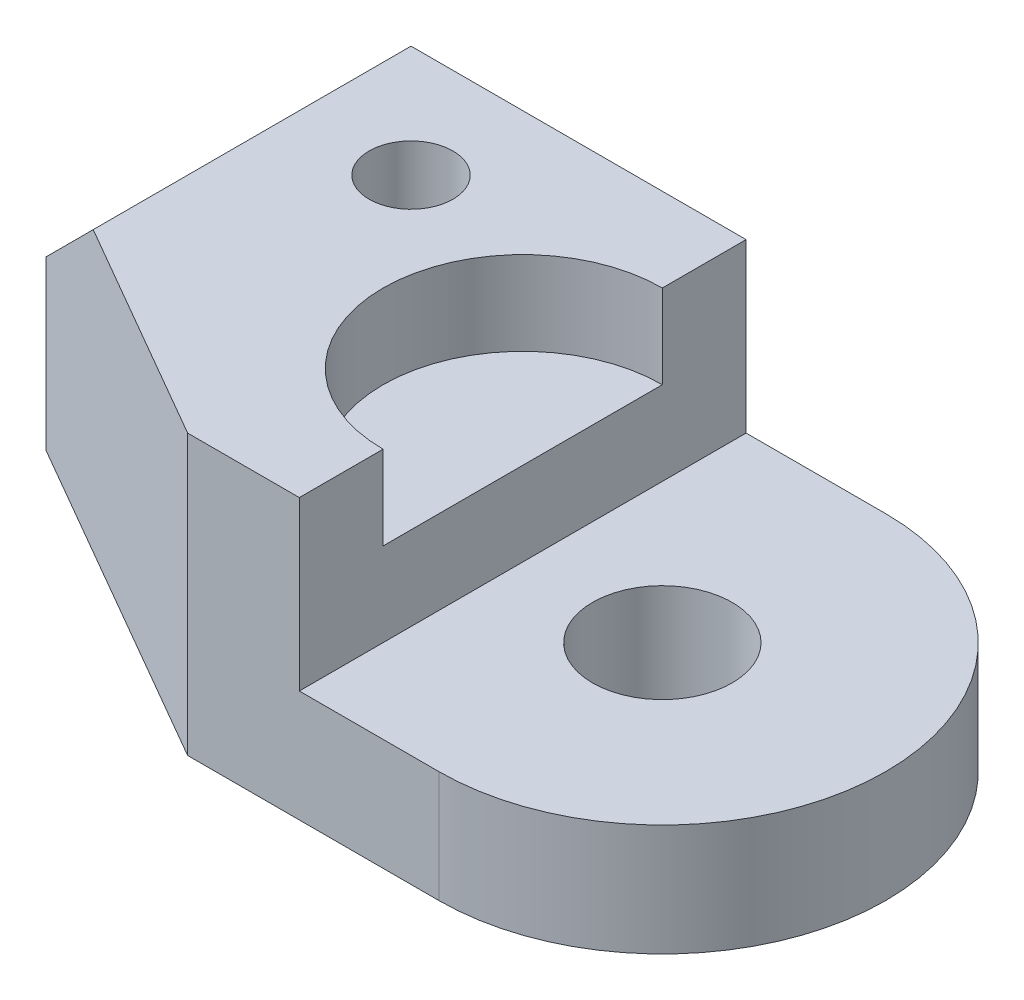
ISO-10303-21;
HEADER;
FILE_DESCRIPTION(('STEP AP214'),'2;1');
FILE_NAME('part.step','',(''),(''),'','','');
FILE_SCHEMA(('AUTOMOTIVE_DESIGN { 1 0 10303 214 1 1 1 1 }'));
ENDSEC;
DATA;
#1=APPLICATION_CONTEXT('core data for automotive mechanical design processes');
#2=APPLICATION_PROTOCOL_DEFINITION('international standard','automotive_design',2000,#1);
#3=PRODUCT_CONTEXT('',#1,'mechanical');
#4=PRODUCT('Part','Part','',(#3));
#5=PRODUCT_RELATED_PRODUCT_CATEGORY('part','',(#4));
#6=PRODUCT_DEFINITION_FORMATION('','',#4);
#7=PRODUCT_DEFINITION_CONTEXT('part definition',#1,'design');
#8=PRODUCT_DEFINITION('design','',#6,#7);
#9=PRODUCT_DEFINITION_SHAPE('','',#8);
#10=(LENGTH_UNIT() NAMED_UNIT(*) SI_UNIT(.MILLI.,.METRE.));
#11=(NAMED_UNIT(*) PLANE_ANGLE_UNIT() SI_UNIT($,.RADIAN.));
#12=(NAMED_UNIT(*) SI_UNIT($,.STERADIAN.) SOLID_ANGLE_UNIT());
#13=UNCERTAINTY_MEASURE_WITH_UNIT(LENGTH_MEASURE(1.E-05),#10,'distance_accuracy_value','');
#14=(GEOMETRIC_REPRESENTATION_CONTEXT(3) GLOBAL_UNCERTAINTY_ASSIGNED_CONTEXT((#13)) GLOBAL_UNIT_ASSIGNED_CONTEXT((#10,
#11,#12)) REPRESENTATION_CONTEXT('',''));
#15=CARTESIAN_POINT('',(0.,0.,0.));
#16=DIRECTION('',(0.,0.,1.));
#17=DIRECTION('',(1.,0.,0.));
#18=AXIS2_PLACEMENT_3D('',#15,#16,#17);
#19=CARTESIAN_POINT('',(0.,25.4,0.));
#20=DIRECTION('',(0.,1.,0.));
#21=DIRECTION('',(0.,0.,1.));
#22=AXIS2_PLACEMENT_3D('',#19,#20,#21);
#23=PLANE('',#22);
#24=DIRECTION('',(-1.,0.,0.));
#25=VECTOR('',#24,1.);
#26=CARTESIAN_POINT('',(-31.75,25.4,-50.8));
#27=LINE('',#26,#25);
#28=CARTESIAN_POINT('',(0.,25.4,-50.8));
#29=VERTEX_POINT('',#28);
#30=CARTESIAN_POINT('',(-31.75,25.4,-50.8));
#31=VERTEX_POINT('',#30);
#32=EDGE_CURVE('E198',#29,#31,#27,.T.);
#33=ORIENTED_EDGE('',*,*,#32,.T.);
#34=DIRECTION('',(0.,0.,1.));
#35=VECTOR('',#34,1.);
#36=CARTESIAN_POINT('',(-31.75,25.4,-50.8));
#37=LINE('',#36,#35);
#38=CARTESIAN_POINT('',(-31.75,25.4,50.8));
#39=VERTEX_POINT('',#38);
#40=EDGE_CURVE('E202',#31,#39,#37,.T.);
#41=ORIENTED_EDGE('',*,*,#40,.T.);
#42=DIRECTION('',(1.,0.,0.));
#43=VECTOR('',#42,1.);
#44=CARTESIAN_POINT('',(-31.75,25.4,50.8));
#45=LINE('',#44,#43);
#46=CARTESIAN_POINT('',(0.,25.4,50.8));
#47=VERTEX_POINT('',#46);
#48=EDGE_CURVE('E207',#39,#47,#45,.T.);
#49=ORIENTED_EDGE('',*,*,#48,.T.);
#50=CARTESIAN_POINT('',(0.,25.4,0.));
#51=DIRECTION('',(0.,1.,0.));
#52=DIRECTION('',(0.,0.,1.));
#53=AXIS2_PLACEMENT_3D('',#50,#51,#52);
#54=CIRCLE('',#53,50.8);
#55=EDGE_CURVE('E210',#47,#29,#54,.T.);
#56=ORIENTED_EDGE('',*,*,#55,.T.);
#57=EDGE_LOOP('',(#33,#41,#49,#56));
#58=FACE_BOUND('',#57,.T.);
#59=CARTESIAN_POINT('',(0.,25.4,0.));
#60=DIRECTION('',(0.,1.,0.));
#61=DIRECTION('',(0.,0.,1.));
#62=AXIS2_PLACEMENT_3D('',#59,#60,#61);
#63=CIRCLE('',#62,15.875);
#64=CARTESIAN_POINT('',(0.,25.4,15.875));
#65=VERTEX_POINT('',#64);
#66=EDGE_CURVE('E190',#65,#65,#63,.T.);
#67=ORIENTED_EDGE('',*,*,#66,.F.);
#68=EDGE_LOOP('',(#67));
#69=FACE_BOUND('',#68,.T.);
#70=ADVANCED_FACE('F38',(#58,#69),#23,.T.);
#71=CARTESIAN_POINT('',(0.,0.,0.));
#72=DIRECTION('',(0.,1.,0.));
#73=DIRECTION('',(0.,0.,1.));
#74=AXIS2_PLACEMENT_3D('',#71,#72,#73);
#75=PLANE('',#74);
#76=CARTESIAN_POINT('',(-82.55,0.,-25.4));
#77=DIRECTION('',(0.,1.,0.));
#78=DIRECTION('',(0.,0.,1.));
#79=AXIS2_PLACEMENT_3D('',#76,#77,#78);
#80=CIRCLE('',#79,9.52499999999999);
#81=CARTESIAN_POINT('',(-82.55,0.,-15.875));
#82=VERTEX_POINT('',#81);
#83=EDGE_CURVE('E138',#82,#82,#80,.T.);
#84=ORIENTED_EDGE('',*,*,#83,.T.);
#85=EDGE_LOOP('',(#84));
#86=FACE_BOUND('',#85,.T.);
#87=DIRECTION('',(-1.,0.,0.));
#88=VECTOR('',#87,1.);
#89=CARTESIAN_POINT('',(-31.75,0.,-50.8));
#90=LINE('',#89,#88);
#91=CARTESIAN_POINT('',(0.,0.,-50.8));
#92=VERTEX_POINT('',#91);
#93=CARTESIAN_POINT('',(-133.35,0.,-50.8));
#94=VERTEX_POINT('',#93);
#95=EDGE_CURVE('E194',#92,#94,#90,.T.);
#96=ORIENTED_EDGE('',*,*,#95,.F.);
#97=CARTESIAN_POINT('',(0.,0.,0.));
#98=DIRECTION('',(0.,1.,0.));
#99=DIRECTION('',(0.,0.,1.));
#100=AXIS2_PLACEMENT_3D('',#97,#98,#99);
#101=CIRCLE('',#100,50.8);
#102=CARTESIAN_POINT('',(0.,0.,50.8));
#103=VERTEX_POINT('',#102);
#104=EDGE_CURVE('E203',#103,#92,#101,.T.);
#105=ORIENTED_EDGE('',*,*,#104,.F.);
#106=DIRECTION('',(1.,0.,0.));
#107=VECTOR('',#106,1.);
#108=CARTESIAN_POINT('',(-31.75,0.,50.8));
#109=LINE('',#108,#107);
#110=CARTESIAN_POINT('',(-57.15,0.,50.8));
#111=VERTEX_POINT('',#110);
#112=EDGE_CURVE('E217',#111,#103,#109,.T.);
#113=ORIENTED_EDGE('',*,*,#112,.F.);
#114=DIRECTION('',(0.866025403784438,0.,0.500000000000001));
#115=VECTOR('',#114,1.);
#116=CARTESIAN_POINT('',(-57.15,0.,50.8));
#117=LINE('',#116,#115);
#118=CARTESIAN_POINT('',(-133.35,0.,6.80590948775044));
#119=VERTEX_POINT('',#118);
#120=EDGE_CURVE('E169',#119,#111,#117,.T.);
#121=ORIENTED_EDGE('',*,*,#120,.F.);
#122=DIRECTION('',(0.,0.,1.));
#123=VECTOR('',#122,1.);
#124=CARTESIAN_POINT('',(-133.35,0.,-50.8));
#125=LINE('',#124,#123);
#126=EDGE_CURVE('E150',#94,#119,#125,.T.);
#127=ORIENTED_EDGE('',*,*,#126,.F.);
#128=EDGE_LOOP('',(#96,#105,#113,#121,#127));
#129=FACE_BOUND('',#128,.T.);
#130=CARTESIAN_POINT('',(0.,0.,0.));
#131=DIRECTION('',(0.,1.,0.));
#132=DIRECTION('',(0.,0.,1.));
#133=AXIS2_PLACEMENT_3D('',#130,#131,#132);
#134=CIRCLE('',#133,15.875);
#135=CARTESIAN_POINT('',(0.,0.,15.875));
#136=VERTEX_POINT('',#135);
#137=EDGE_CURVE('E189',#136,#136,#134,.T.);
#138=ORIENTED_EDGE('',*,*,#137,.T.);
#139=EDGE_LOOP('',(#138));
#140=FACE_BOUND('',#139,.T.);
#141=ADVANCED_FACE('F236',(#86,#129,#140),#75,.F.);
#142=CARTESIAN_POINT('',(-31.75,25.4,-50.8));
#143=DIRECTION('',(0.,0.,1.));
#144=DIRECTION('',(1.,0.,0.));
#145=AXIS2_PLACEMENT_3D('',#142,#143,#144);
#146=PLANE('',#145);
#147=DIRECTION('',(0.,-1.,0.));
#148=VECTOR('',#147,1.);
#149=CARTESIAN_POINT('',(-133.35,63.5,-50.8));
#150=LINE('',#149,#148);
#151=CARTESIAN_POINT('',(-133.35,38.1,-50.8));
#152=VERTEX_POINT('',#151);
#153=EDGE_CURVE('E182',#152,#94,#150,.T.);
#154=ORIENTED_EDGE('',*,*,#153,.F.);
#155=DIRECTION('',(-0.707106781186543,-0.707106781186552,0.));
#156=VECTOR('',#155,1.);
#157=CARTESIAN_POINT('',(-133.35,38.1,-50.8));
#158=LINE('',#157,#156);
#159=CARTESIAN_POINT('',(-107.95,63.5,-50.8));
#160=VERTEX_POINT('',#159);
#161=EDGE_CURVE('E140',#160,#152,#158,.T.);
#162=ORIENTED_EDGE('',*,*,#161,.F.);
#163=DIRECTION('',(-1.,0.,0.));
#164=VECTOR('',#163,1.);
#165=CARTESIAN_POINT('',(-31.75,63.5,-50.8));
#166=LINE('',#165,#164);
#167=CARTESIAN_POINT('',(-31.75,63.5,-50.8));
#168=VERTEX_POINT('',#167);
#169=EDGE_CURVE('E154',#168,#160,#166,.T.);
#170=ORIENTED_EDGE('',*,*,#169,.F.);
#171=DIRECTION('',(0.,-1.,0.));
#172=VECTOR('',#171,1.);
#173=CARTESIAN_POINT('',(-31.75,63.5,-50.8));
#174=LINE('',#173,#172);
#175=EDGE_CURVE('E185',#168,#31,#174,.T.);
#176=ORIENTED_EDGE('',*,*,#175,.T.);
#177=ORIENTED_EDGE('',*,*,#32,.F.);
#178=DIRECTION('',(0.,-1.,0.));
#179=VECTOR('',#178,1.);
#180=CARTESIAN_POINT('',(0.,25.4,-50.8));
#181=LINE('',#180,#179);
#182=EDGE_CURVE('E213',#29,#92,#181,.T.);
#183=ORIENTED_EDGE('',*,*,#182,.T.);
#184=ORIENTED_EDGE('',*,*,#95,.T.);
#185=EDGE_LOOP('',(#154,#162,#170,#176,#177,#183,#184));
#186=FACE_BOUND('',#185,.T.);
#187=ADVANCED_FACE('F40',(#186),#146,.F.);
#188=CARTESIAN_POINT('',(-31.75,25.4,50.8));
#189=DIRECTION('',(0.,0.,-1.));
#190=DIRECTION('',(-1.,0.,0.));
#191=AXIS2_PLACEMENT_3D('',#188,#189,#190);
#192=PLANE('',#191);
#193=ORIENTED_EDGE('',*,*,#112,.T.);
#194=DIRECTION('',(0.,-1.,0.));
#195=VECTOR('',#194,1.);
#196=CARTESIAN_POINT('',(0.,25.4,50.8));
#197=LINE('',#196,#195);
#198=EDGE_CURVE('E47',#47,#103,#197,.T.);
#199=ORIENTED_EDGE('',*,*,#198,.F.);
#200=ORIENTED_EDGE('',*,*,#48,.F.);
#201=DIRECTION('',(0.,-1.,0.));
#202=VECTOR('',#201,1.);
#203=CARTESIAN_POINT('',(-31.75,63.5,50.8));
#204=LINE('',#203,#202);
#205=CARTESIAN_POINT('',(-31.75,63.5,50.8));
#206=VERTEX_POINT('',#205);
#207=EDGE_CURVE('E165',#206,#39,#204,.T.);
#208=ORIENTED_EDGE('',*,*,#207,.F.);
#209=DIRECTION('',(1.,0.,0.));
#210=VECTOR('',#209,1.);
#211=CARTESIAN_POINT('',(-31.75,63.5,50.8));
#212=LINE('',#211,#210);
#213=CARTESIAN_POINT('',(-57.15,63.5,50.8));
#214=VERTEX_POINT('',#213);
#215=EDGE_CURVE('E162',#214,#206,#212,.T.);
#216=ORIENTED_EDGE('',*,*,#215,.F.);
#217=DIRECTION('',(0.,-1.,0.));
#218=VECTOR('',#217,1.);
#219=CARTESIAN_POINT('',(-57.15,63.5,50.8));
#220=LINE('',#219,#218);
#221=EDGE_CURVE('E175',#214,#111,#220,.T.);
#222=ORIENTED_EDGE('',*,*,#221,.T.);
#223=EDGE_LOOP('',(#193,#199,#200,#208,#216,#222));
#224=FACE_BOUND('',#223,.T.);
#225=ADVANCED_FACE('F249',(#224),#192,.F.);
#226=CARTESIAN_POINT('',(0.,25.4,0.));
#227=DIRECTION('',(0.,-1.,0.));
#228=DIRECTION('',(0.,0.,-1.));
#229=AXIS2_PLACEMENT_3D('',#226,#227,#228);
#230=CYLINDRICAL_SURFACE('',#229,50.8);
#231=ORIENTED_EDGE('',*,*,#104,.T.);
#232=ORIENTED_EDGE('',*,*,#182,.F.);
#233=ORIENTED_EDGE('',*,*,#55,.F.);
#234=ORIENTED_EDGE('',*,*,#198,.T.);
#235=EDGE_LOOP('',(#231,#232,#233,#234));
#236=FACE_BOUND('',#235,.T.);
#237=ADVANCED_FACE('F230',(#236),#230,.T.);
#238=CARTESIAN_POINT('',(0.,25.4,0.));
#239=DIRECTION('',(0.,-1.,0.));
#240=DIRECTION('',(0.,0.,-1.));
#241=AXIS2_PLACEMENT_3D('',#238,#239,#240);
#242=CYLINDRICAL_SURFACE('',#241,15.875);
#243=ORIENTED_EDGE('',*,*,#66,.T.);
#244=EDGE_LOOP('',(#243));
#245=FACE_BOUND('',#244,.T.);
#246=ORIENTED_EDGE('',*,*,#137,.F.);
#247=EDGE_LOOP('',(#246));
#248=FACE_BOUND('',#247,.T.);
#249=ADVANCED_FACE('F279',(#245,#248),#242,.F.);
#250=CARTESIAN_POINT('',(-31.75,63.5,-50.8));
#251=DIRECTION('',(-1.,0.,0.));
#252=DIRECTION('',(0.,0.,1.));
#253=AXIS2_PLACEMENT_3D('',#250,#251,#252);
#254=PLANE('',#253);
#255=DIRECTION('',(0.,0.,-1.));
#256=VECTOR('',#255,1.);
#257=CARTESIAN_POINT('',(-31.75,44.45,-31.75));
#258=LINE('',#257,#256);
#259=CARTESIAN_POINT('',(-31.75,44.45,31.75));
#260=VERTEX_POINT('',#259);
#261=CARTESIAN_POINT('',(-31.75,44.45,-31.75));
#262=VERTEX_POINT('',#261);
#263=EDGE_CURVE('E124',#260,#262,#258,.T.);
#264=ORIENTED_EDGE('',*,*,#263,.F.);
#265=DIRECTION('',(0.,1.,0.));
#266=VECTOR('',#265,1.);
#267=CARTESIAN_POINT('',(-31.75,44.45,31.75));
#268=LINE('',#267,#266);
#269=CARTESIAN_POINT('',(-31.75,63.5,31.75));
#270=VERTEX_POINT('',#269);
#271=EDGE_CURVE('E113',#260,#270,#268,.T.);
#272=ORIENTED_EDGE('',*,*,#271,.T.);
#273=DIRECTION('',(0.,0.,-1.));
#274=VECTOR('',#273,1.);
#275=CARTESIAN_POINT('',(-31.75,63.5,-50.8));
#276=LINE('',#275,#274);
#277=EDGE_CURVE('E151',#206,#270,#276,.T.);
#278=ORIENTED_EDGE('',*,*,#277,.F.);
#279=ORIENTED_EDGE('',*,*,#207,.T.);
#280=ORIENTED_EDGE('',*,*,#40,.F.);
#281=ORIENTED_EDGE('',*,*,#175,.F.);
#282=CARTESIAN_POINT('',(-31.75,63.5,-31.75));
#283=VERTEX_POINT('',#282);
#284=EDGE_CURVE('E155',#283,#168,#276,.T.);
#285=ORIENTED_EDGE('',*,*,#284,.F.);
#286=DIRECTION('',(0.,1.,0.));
#287=VECTOR('',#286,1.);
#288=CARTESIAN_POINT('',(-31.75,44.45,-31.75));
#289=LINE('',#288,#287);
#290=EDGE_CURVE('E54',#262,#283,#289,.T.);
#291=ORIENTED_EDGE('',*,*,#290,.F.);
#292=EDGE_LOOP('',(#264,#272,#278,#279,#280,#281,#285,#291));
#293=FACE_BOUND('',#292,.T.);
#294=ADVANCED_FACE('F130',(#293),#254,.F.);
#295=CARTESIAN_POINT('',(-133.35,63.5,-50.8));
#296=DIRECTION('',(1.,0.,0.));
#297=DIRECTION('',(0.,0.,-1.));
#298=AXIS2_PLACEMENT_3D('',#295,#296,#297);
#299=PLANE('',#298);
#300=DIRECTION('',(0.,-1.,0.));
#301=VECTOR('',#300,1.);
#302=CARTESIAN_POINT('',(-133.35,63.5,6.80590948775044));
#303=LINE('',#302,#301);
#304=CARTESIAN_POINT('',(-133.35,38.1,6.80590948775042));
#305=VERTEX_POINT('',#304);
#306=EDGE_CURVE('E179',#305,#119,#303,.T.);
#307=ORIENTED_EDGE('',*,*,#306,.F.);
#308=DIRECTION('',(0.,0.,-1.));
#309=VECTOR('',#308,1.);
#310=CARTESIAN_POINT('',(-133.35,38.1,50.8));
#311=LINE('',#310,#309);
#312=EDGE_CURVE('E144',#305,#152,#311,.T.);
#313=ORIENTED_EDGE('',*,*,#312,.T.);
#314=ORIENTED_EDGE('',*,*,#153,.T.);
#315=ORIENTED_EDGE('',*,*,#126,.T.);
#316=EDGE_LOOP('',(#307,#313,#314,#315));
#317=FACE_BOUND('',#316,.T.);
#318=ADVANCED_FACE('F259',(#317),#299,.F.);
#319=CARTESIAN_POINT('',(-57.15,63.5,50.8));
#320=DIRECTION('',(0.500000000000001,0.,-0.866025403784438));
#321=DIRECTION('',(-0.866025403784438,0.,-0.500000000000001));
#322=AXIS2_PLACEMENT_3D('',#319,#320,#321);
#323=PLANE('',#322);
#324=DIRECTION('',(0.866025403784438,0.,0.500000000000001));
#325=VECTOR('',#324,1.);
#326=CARTESIAN_POINT('',(-57.15,63.5,50.8));
#327=LINE('',#326,#325);
#328=CARTESIAN_POINT('',(-107.95,63.5,21.4706063251668));
#329=VERTEX_POINT('',#328);
#330=EDGE_CURVE('E159',#329,#214,#327,.T.);
#331=ORIENTED_EDGE('',*,*,#330,.F.);
#332=DIRECTION('',(-0.654653670707974,-0.654653670707981,-0.377964473009226));
#333=VECTOR('',#332,1.);
#334=CARTESIAN_POINT('',(-78.921428571429,92.5285714285717,38.2302598536427));
#335=LINE('',#334,#333);
#336=EDGE_CURVE('E62',#329,#305,#335,.T.);
#337=ORIENTED_EDGE('',*,*,#336,.T.);
#338=ORIENTED_EDGE('',*,*,#306,.T.);
#339=ORIENTED_EDGE('',*,*,#120,.T.);
#340=ORIENTED_EDGE('',*,*,#221,.F.);
#341=EDGE_LOOP('',(#331,#337,#338,#339,#340));
#342=FACE_BOUND('',#341,.T.);
#343=ADVANCED_FACE('F256',(#342),#323,.F.);
#344=CARTESIAN_POINT('',(0.,63.5,0.));
#345=DIRECTION('',(0.,-1.,0.));
#346=DIRECTION('',(0.,0.,-1.));
#347=AXIS2_PLACEMENT_3D('',#344,#345,#346);
#348=PLANE('',#347);
#349=CARTESIAN_POINT('',(-82.55,63.5,-25.4));
#350=DIRECTION('',(0.,1.,0.));
#351=DIRECTION('',(0.,0.,1.));
#352=AXIS2_PLACEMENT_3D('',#349,#350,#351);
#353=CIRCLE('',#352,9.52500000000001);
#354=CARTESIAN_POINT('',(-82.55,63.5,-15.875));
#355=VERTEX_POINT('',#354);
#356=EDGE_CURVE('E395',#355,#355,#353,.T.);
#357=ORIENTED_EDGE('',*,*,#356,.F.);
#358=EDGE_LOOP('',(#357));
#359=FACE_BOUND('',#358,.T.);
#360=ORIENTED_EDGE('',*,*,#277,.T.);
#361=CARTESIAN_POINT('',(-31.75,63.5,0.));
#362=DIRECTION('',(0.,1.,0.));
#363=DIRECTION('',(0.,0.,1.));
#364=AXIS2_PLACEMENT_3D('',#361,#362,#363);
#365=CIRCLE('',#364,31.75);
#366=EDGE_CURVE('E118',#283,#270,#365,.T.);
#367=ORIENTED_EDGE('',*,*,#366,.F.);
#368=ORIENTED_EDGE('',*,*,#284,.T.);
#369=ORIENTED_EDGE('',*,*,#169,.T.);
#370=DIRECTION('',(0.,0.,1.));
#371=VECTOR('',#370,1.);
#372=CARTESIAN_POINT('',(-107.95,63.5,0.));
#373=LINE('',#372,#371);
#374=EDGE_CURVE('E11',#160,#329,#373,.T.);
#375=ORIENTED_EDGE('',*,*,#374,.T.);
#376=ORIENTED_EDGE('',*,*,#330,.T.);
#377=ORIENTED_EDGE('',*,*,#215,.T.);
#378=EDGE_LOOP('',(#360,#367,#368,#369,#375,#376,#377));
#379=FACE_BOUND('',#378,.T.);
#380=ADVANCED_FACE('F252',(#359,#379),#348,.F.);
#381=CARTESIAN_POINT('',(-133.35,38.1,50.8));
#382=DIRECTION('',(0.707106781186552,-0.707106781186543,0.));
#383=DIRECTION('',(0.707106781186543,0.707106781186552,0.));
#384=AXIS2_PLACEMENT_3D('',#381,#382,#383);
#385=PLANE('',#384);
#386=ORIENTED_EDGE('',*,*,#374,.F.);
#387=ORIENTED_EDGE('',*,*,#161,.T.);
#388=ORIENTED_EDGE('',*,*,#312,.F.);
#389=ORIENTED_EDGE('',*,*,#336,.F.);
#390=EDGE_LOOP('',(#386,#387,#388,#389));
#391=FACE_BOUND('',#390,.T.);
#392=ADVANCED_FACE('F260',(#391),#385,.F.);
#393=CARTESIAN_POINT('',(-31.75,44.45,0.));
#394=DIRECTION('',(0.,1.,0.));
#395=DIRECTION('',(0.,0.,1.));
#396=AXIS2_PLACEMENT_3D('',#393,#394,#395);
#397=CYLINDRICAL_SURFACE('',#396,31.75);
#398=ORIENTED_EDGE('',*,*,#366,.T.);
#399=ORIENTED_EDGE('',*,*,#271,.F.);
#400=CARTESIAN_POINT('',(-31.75,44.45,0.));
#401=DIRECTION('',(0.,1.,0.));
#402=DIRECTION('',(0.,0.,1.));
#403=AXIS2_PLACEMENT_3D('',#400,#401,#402);
#404=CIRCLE('',#403,31.75);
#405=EDGE_CURVE('E116',#262,#260,#404,.T.);
#406=ORIENTED_EDGE('',*,*,#405,.F.);
#407=ORIENTED_EDGE('',*,*,#290,.T.);
#408=EDGE_LOOP('',(#398,#399,#406,#407));
#409=FACE_BOUND('',#408,.T.);
#410=ADVANCED_FACE('F115',(#409),#397,.F.);
#411=CARTESIAN_POINT('',(-31.75,44.45,0.));
#412=DIRECTION('',(0.,1.,0.));
#413=DIRECTION('',(0.,0.,1.));
#414=AXIS2_PLACEMENT_3D('',#411,#412,#413);
#415=PLANE('',#414);
#416=ORIENTED_EDGE('',*,*,#405,.T.);
#417=ORIENTED_EDGE('',*,*,#263,.T.);
#418=EDGE_LOOP('',(#416,#417));
#419=FACE_BOUND('',#418,.T.);
#420=ADVANCED_FACE('F127',(#419),#415,.T.);
#421=CARTESIAN_POINT('',(-82.55,63.5,-25.4));
#422=DIRECTION('',(0.,1.,0.));
#423=DIRECTION('',(0.,0.,1.));
#424=AXIS2_PLACEMENT_3D('',#421,#422,#423);
#425=CYLINDRICAL_SURFACE('',#424,9.525);
#426=ORIENTED_EDGE('',*,*,#83,.F.);
#427=EDGE_LOOP('',(#426));
#428=FACE_BOUND('',#427,.T.);
#429=ORIENTED_EDGE('',*,*,#356,.T.);
#430=EDGE_LOOP('',(#429));
#431=FACE_BOUND('',#430,.T.);
#432=ADVANCED_FACE('F315',(#428,#431),#425,.F.);
#433=CLOSED_SHELL('',(#70,#141,#187,#225,#237,#249,#294,#318,#343,#380,#392,#410,#420,#432));
#434=MANIFOLD_SOLID_BREP('B2',#433);
#435=ADVANCED_BREP_SHAPE_REPRESENTATION('',(#18,#434),#14);
#436=SHAPE_DEFINITION_REPRESENTATION(#9,#435);
ENDSEC;
END-ISO-10303-21;
